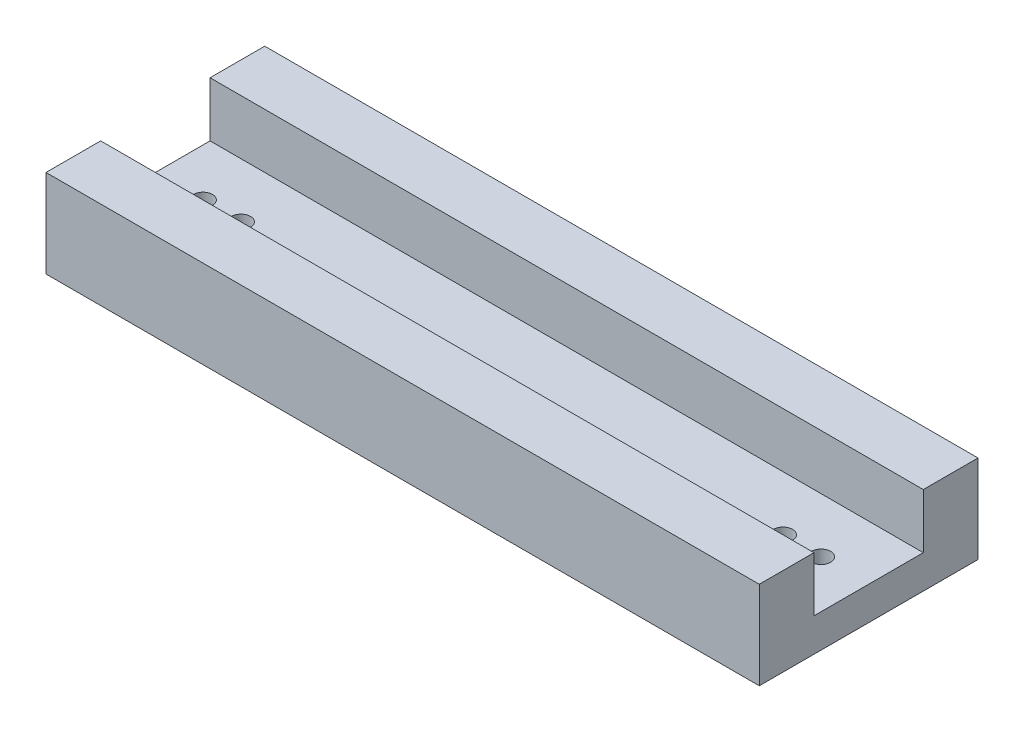
ISO-10303-21;
HEADER;
FILE_DESCRIPTION(('STEP AP214'),'2;1');
FILE_NAME('part.step','',(''),(''),'','','');
FILE_SCHEMA(('AUTOMOTIVE_DESIGN { 1 0 10303 214 1 1 1 1 }'));
ENDSEC;
DATA;
#1=APPLICATION_CONTEXT('core data for automotive mechanical design processes');
#2=APPLICATION_PROTOCOL_DEFINITION('international standard','automotive_design',2000,#1);
#3=PRODUCT_CONTEXT('',#1,'mechanical');
#4=PRODUCT('Part','Part','',(#3));
#5=PRODUCT_RELATED_PRODUCT_CATEGORY('part','',(#4));
#6=PRODUCT_DEFINITION_FORMATION('','',#4);
#7=PRODUCT_DEFINITION_CONTEXT('part definition',#1,'design');
#8=PRODUCT_DEFINITION('design','',#6,#7);
#9=PRODUCT_DEFINITION_SHAPE('','',#8);
#10=(LENGTH_UNIT() NAMED_UNIT(*) SI_UNIT(.MILLI.,.METRE.));
#11=(NAMED_UNIT(*) PLANE_ANGLE_UNIT() SI_UNIT($,.RADIAN.));
#12=(NAMED_UNIT(*) SI_UNIT($,.STERADIAN.) SOLID_ANGLE_UNIT());
#13=UNCERTAINTY_MEASURE_WITH_UNIT(LENGTH_MEASURE(1.E-05),#10,'distance_accuracy_value','');
#14=(GEOMETRIC_REPRESENTATION_CONTEXT(3) GLOBAL_UNCERTAINTY_ASSIGNED_CONTEXT((#13)) GLOBAL_UNIT_ASSIGNED_CONTEXT((#10,
#11,#12)) REPRESENTATION_CONTEXT('',''));
#15=CARTESIAN_POINT('',(0.,0.,0.));
#16=DIRECTION('',(0.,0.,1.));
#17=DIRECTION('',(1.,0.,0.));
#18=AXIS2_PLACEMENT_3D('',#15,#16,#17);
#19=CARTESIAN_POINT('',(150.,0.,0.));
#20=DIRECTION('',(0.,0.,-1.));
#21=DIRECTION('',(0.,1.,0.));
#22=AXIS2_PLACEMENT_3D('',#19,#20,#21);
#23=PLANE('',#22);
#24=DIRECTION('',(0.,-1.,0.));
#25=VECTOR('',#24,1.);
#26=CARTESIAN_POINT('',(0.,0.,0.));
#27=LINE('',#26,#25);
#28=CARTESIAN_POINT('',(0.,18.5,0.));
#29=VERTEX_POINT('',#28);
#30=CARTESIAN_POINT('',(0.,0.,0.));
#31=VERTEX_POINT('',#30);
#32=EDGE_CURVE('E133',#29,#31,#27,.T.);
#33=ORIENTED_EDGE('',*,*,#32,.T.);
#34=DIRECTION('',(-1.,0.,0.));
#35=VECTOR('',#34,1.);
#36=CARTESIAN_POINT('',(150.,0.,0.));
#37=LINE('',#36,#35);
#38=CARTESIAN_POINT('',(150.,0.,0.));
#39=VERTEX_POINT('',#38);
#40=EDGE_CURVE('E11',#39,#31,#37,.T.);
#41=ORIENTED_EDGE('',*,*,#40,.F.);
#42=DIRECTION('',(0.,-1.,0.));
#43=VECTOR('',#42,1.);
#44=CARTESIAN_POINT('',(150.,0.,0.));
#45=LINE('',#44,#43);
#46=CARTESIAN_POINT('',(150.,18.5,0.));
#47=VERTEX_POINT('',#46);
#48=EDGE_CURVE('E148',#47,#39,#45,.T.);
#49=ORIENTED_EDGE('',*,*,#48,.F.);
#50=DIRECTION('',(-1.,0.,0.));
#51=VECTOR('',#50,1.);
#52=CARTESIAN_POINT('',(150.,18.5,0.));
#53=LINE('',#52,#51);
#54=EDGE_CURVE('E129',#47,#29,#53,.T.);
#55=ORIENTED_EDGE('',*,*,#54,.T.);
#56=EDGE_LOOP('',(#33,#41,#49,#55));
#57=FACE_BOUND('',#56,.T.);
#58=ADVANCED_FACE('F35',(#57),#23,.F.);
#59=CARTESIAN_POINT('',(150.,0.,0.));
#60=DIRECTION('',(0.,1.,0.));
#61=DIRECTION('',(0.,0.,1.));
#62=AXIS2_PLACEMENT_3D('',#59,#60,#61);
#63=PLANE('',#62);
#64=CARTESIAN_POINT('',(18.,0.,-23.));
#65=DIRECTION('',(0.,-1.,0.));
#66=DIRECTION('',(0.,0.,1.));
#67=AXIS2_PLACEMENT_3D('',#64,#65,#66);
#68=CIRCLE('',#67,2.);
#69=CARTESIAN_POINT('',(18.,0.,-21.));
#70=VERTEX_POINT('',#69);
#71=EDGE_CURVE('E178',#70,#70,#68,.T.);
#72=ORIENTED_EDGE('',*,*,#71,.F.);
#73=EDGE_LOOP('',(#72));
#74=FACE_BOUND('',#73,.T.);
#75=CARTESIAN_POINT('',(132.,0.,-23.));
#76=DIRECTION('',(0.,-1.,0.));
#77=DIRECTION('',(0.,0.,-1.));
#78=AXIS2_PLACEMENT_3D('',#75,#76,#77);
#79=CIRCLE('',#78,2.);
#80=CARTESIAN_POINT('',(132.,0.,-25.));
#81=VERTEX_POINT('',#80);
#82=EDGE_CURVE('E168',#81,#81,#79,.T.);
#83=ORIENTED_EDGE('',*,*,#82,.F.);
#84=EDGE_LOOP('',(#83));
#85=FACE_BOUND('',#84,.T.);
#86=CARTESIAN_POINT('',(10.,0.,-23.));
#87=DIRECTION('',(0.,-1.,0.));
#88=DIRECTION('',(0.,0.,1.));
#89=AXIS2_PLACEMENT_3D('',#86,#87,#88);
#90=CIRCLE('',#89,2.);
#91=CARTESIAN_POINT('',(10.,0.,-21.));
#92=VERTEX_POINT('',#91);
#93=EDGE_CURVE('E165',#92,#92,#90,.T.);
#94=ORIENTED_EDGE('',*,*,#93,.F.);
#95=EDGE_LOOP('',(#94));
#96=FACE_BOUND('',#95,.T.);
#97=CARTESIAN_POINT('',(140.,0.,-23.));
#98=DIRECTION('',(0.,-1.,0.));
#99=DIRECTION('',(0.,0.,-1.));
#100=AXIS2_PLACEMENT_3D('',#97,#98,#99);
#101=CIRCLE('',#100,2.);
#102=CARTESIAN_POINT('',(140.,0.,-25.));
#103=VERTEX_POINT('',#102);
#104=EDGE_CURVE('E162',#103,#103,#101,.T.);
#105=ORIENTED_EDGE('',*,*,#104,.F.);
#106=EDGE_LOOP('',(#105));
#107=FACE_BOUND('',#106,.T.);
#108=DIRECTION('',(0.,0.,-1.));
#109=VECTOR('',#108,1.);
#110=CARTESIAN_POINT('',(0.,0.,0.));
#111=LINE('',#110,#109);
#112=CARTESIAN_POINT('',(0.,0.,-46.));
#113=VERTEX_POINT('',#112);
#114=EDGE_CURVE('E136',#31,#113,#111,.T.);
#115=ORIENTED_EDGE('',*,*,#114,.T.);
#116=DIRECTION('',(-1.,0.,0.));
#117=VECTOR('',#116,1.);
#118=CARTESIAN_POINT('',(150.,0.,-46.));
#119=LINE('',#118,#117);
#120=CARTESIAN_POINT('',(150.,0.,-46.));
#121=VERTEX_POINT('',#120);
#122=EDGE_CURVE('E44',#121,#113,#119,.T.);
#123=ORIENTED_EDGE('',*,*,#122,.F.);
#124=DIRECTION('',(0.,0.,-1.));
#125=VECTOR('',#124,1.);
#126=CARTESIAN_POINT('',(150.,0.,0.));
#127=LINE('',#126,#125);
#128=EDGE_CURVE('E96',#39,#121,#127,.T.);
#129=ORIENTED_EDGE('',*,*,#128,.F.);
#130=ORIENTED_EDGE('',*,*,#40,.T.);
#131=EDGE_LOOP('',(#115,#123,#129,#130));
#132=FACE_BOUND('',#131,.T.);
#133=ADVANCED_FACE('F216',(#74,#85,#96,#107,#132),#63,.F.);
#134=CARTESIAN_POINT('',(150.,0.,-46.));
#135=DIRECTION('',(0.,0.,1.));
#136=DIRECTION('',(1.,0.,0.));
#137=AXIS2_PLACEMENT_3D('',#134,#135,#136);
#138=PLANE('',#137);
#139=DIRECTION('',(0.,1.,0.));
#140=VECTOR('',#139,1.);
#141=CARTESIAN_POINT('',(0.,0.,-46.));
#142=LINE('',#141,#140);
#143=CARTESIAN_POINT('',(0.,18.5,-46.));
#144=VERTEX_POINT('',#143);
#145=EDGE_CURVE('E139',#113,#144,#142,.T.);
#146=ORIENTED_EDGE('',*,*,#145,.T.);
#147=DIRECTION('',(-1.,0.,0.));
#148=VECTOR('',#147,1.);
#149=CARTESIAN_POINT('',(150.,18.5,-46.));
#150=LINE('',#149,#148);
#151=CARTESIAN_POINT('',(150.,18.5,-46.));
#152=VERTEX_POINT('',#151);
#153=EDGE_CURVE('E155',#152,#144,#150,.T.);
#154=ORIENTED_EDGE('',*,*,#153,.F.);
#155=DIRECTION('',(0.,1.,0.));
#156=VECTOR('',#155,1.);
#157=CARTESIAN_POINT('',(150.,0.,-46.));
#158=LINE('',#157,#156);
#159=EDGE_CURVE('E185',#121,#152,#158,.T.);
#160=ORIENTED_EDGE('',*,*,#159,.F.);
#161=ORIENTED_EDGE('',*,*,#122,.T.);
#162=EDGE_LOOP('',(#146,#154,#160,#161));
#163=FACE_BOUND('',#162,.T.);
#164=ADVANCED_FACE('F220',(#163),#138,.F.);
#165=CARTESIAN_POINT('',(150.,18.5,-46.));
#166=DIRECTION('',(0.,-1.,0.));
#167=DIRECTION('',(0.,0.,-1.));
#168=AXIS2_PLACEMENT_3D('',#165,#166,#167);
#169=PLANE('',#168);
#170=DIRECTION('',(0.,0.,1.));
#171=VECTOR('',#170,1.);
#172=CARTESIAN_POINT('',(0.,18.5,-46.));
#173=LINE('',#172,#171);
#174=CARTESIAN_POINT('',(0.,18.5,-34.5));
#175=VERTEX_POINT('',#174);
#176=EDGE_CURVE('E141',#144,#175,#173,.T.);
#177=ORIENTED_EDGE('',*,*,#176,.T.);
#178=DIRECTION('',(-1.,0.,0.));
#179=VECTOR('',#178,1.);
#180=CARTESIAN_POINT('',(150.,18.5,-34.5));
#181=LINE('',#180,#179);
#182=CARTESIAN_POINT('',(150.,18.5,-34.5));
#183=VERTEX_POINT('',#182);
#184=EDGE_CURVE('E152',#183,#175,#181,.T.);
#185=ORIENTED_EDGE('',*,*,#184,.F.);
#186=DIRECTION('',(0.,0.,1.));
#187=VECTOR('',#186,1.);
#188=CARTESIAN_POINT('',(150.,18.5,-46.));
#189=LINE('',#188,#187);
#190=EDGE_CURVE('E187',#152,#183,#189,.T.);
#191=ORIENTED_EDGE('',*,*,#190,.F.);
#192=ORIENTED_EDGE('',*,*,#153,.T.);
#193=EDGE_LOOP('',(#177,#185,#191,#192));
#194=FACE_BOUND('',#193,.T.);
#195=ADVANCED_FACE('F193',(#194),#169,.F.);
#196=CARTESIAN_POINT('',(150.,18.5,-34.5));
#197=DIRECTION('',(0.,0.,-1.));
#198=DIRECTION('',(-1.,0.,0.));
#199=AXIS2_PLACEMENT_3D('',#196,#197,#198);
#200=PLANE('',#199);
#201=DIRECTION('',(0.,-1.,0.));
#202=VECTOR('',#201,1.);
#203=CARTESIAN_POINT('',(0.,18.5,-34.5));
#204=LINE('',#203,#202);
#205=CARTESIAN_POINT('',(0.,7.,-34.5));
#206=VERTEX_POINT('',#205);
#207=EDGE_CURVE('E143',#175,#206,#204,.T.);
#208=ORIENTED_EDGE('',*,*,#207,.T.);
#209=DIRECTION('',(-1.,0.,0.));
#210=VECTOR('',#209,1.);
#211=CARTESIAN_POINT('',(150.,7.,-34.5));
#212=LINE('',#211,#210);
#213=CARTESIAN_POINT('',(150.,7.,-34.5));
#214=VERTEX_POINT('',#213);
#215=EDGE_CURVE('E124',#214,#206,#212,.T.);
#216=ORIENTED_EDGE('',*,*,#215,.F.);
#217=DIRECTION('',(0.,-1.,0.));
#218=VECTOR('',#217,1.);
#219=CARTESIAN_POINT('',(150.,18.5,-34.5));
#220=LINE('',#219,#218);
#221=EDGE_CURVE('E115',#183,#214,#220,.T.);
#222=ORIENTED_EDGE('',*,*,#221,.F.);
#223=ORIENTED_EDGE('',*,*,#184,.T.);
#224=EDGE_LOOP('',(#208,#216,#222,#223));
#225=FACE_BOUND('',#224,.T.);
#226=ADVANCED_FACE('F197',(#225),#200,.F.);
#227=CARTESIAN_POINT('',(150.,7.,-11.5));
#228=DIRECTION('',(0.,-1.,0.));
#229=DIRECTION('',(0.,0.,-1.));
#230=AXIS2_PLACEMENT_3D('',#227,#228,#229);
#231=PLANE('',#230);
#232=CARTESIAN_POINT('',(18.,7.,-23.));
#233=DIRECTION('',(0.,-1.,0.));
#234=DIRECTION('',(0.,0.,-1.));
#235=AXIS2_PLACEMENT_3D('',#232,#233,#234);
#236=CIRCLE('',#235,2.);
#237=CARTESIAN_POINT('',(18.,7.,-25.));
#238=VERTEX_POINT('',#237);
#239=EDGE_CURVE('E38',#238,#238,#236,.T.);
#240=ORIENTED_EDGE('',*,*,#239,.T.);
#241=EDGE_LOOP('',(#240));
#242=FACE_BOUND('',#241,.T.);
#243=CARTESIAN_POINT('',(132.,7.,-23.));
#244=DIRECTION('',(0.,-1.,0.));
#245=DIRECTION('',(0.,0.,-1.));
#246=AXIS2_PLACEMENT_3D('',#243,#244,#245);
#247=CIRCLE('',#246,2.);
#248=CARTESIAN_POINT('',(132.,7.,-25.));
#249=VERTEX_POINT('',#248);
#250=EDGE_CURVE('E166',#249,#249,#247,.T.);
#251=ORIENTED_EDGE('',*,*,#250,.T.);
#252=EDGE_LOOP('',(#251));
#253=FACE_BOUND('',#252,.T.);
#254=CARTESIAN_POINT('',(10.,7.,-23.));
#255=DIRECTION('',(0.,-1.,0.));
#256=DIRECTION('',(0.,0.,-1.));
#257=AXIS2_PLACEMENT_3D('',#254,#255,#256);
#258=CIRCLE('',#257,2.);
#259=CARTESIAN_POINT('',(10.,7.,-25.));
#260=VERTEX_POINT('',#259);
#261=EDGE_CURVE('E163',#260,#260,#258,.T.);
#262=ORIENTED_EDGE('',*,*,#261,.T.);
#263=EDGE_LOOP('',(#262));
#264=FACE_BOUND('',#263,.T.);
#265=CARTESIAN_POINT('',(140.,7.,-23.));
#266=DIRECTION('',(0.,-1.,0.));
#267=DIRECTION('',(0.,0.,-1.));
#268=AXIS2_PLACEMENT_3D('',#265,#266,#267);
#269=CIRCLE('',#268,2.);
#270=CARTESIAN_POINT('',(140.,7.,-25.));
#271=VERTEX_POINT('',#270);
#272=EDGE_CURVE('E137',#271,#271,#269,.T.);
#273=ORIENTED_EDGE('',*,*,#272,.T.);
#274=EDGE_LOOP('',(#273));
#275=FACE_BOUND('',#274,.T.);
#276=DIRECTION('',(0.,0.,1.));
#277=VECTOR('',#276,1.);
#278=CARTESIAN_POINT('',(0.,7.,-11.5));
#279=LINE('',#278,#277);
#280=CARTESIAN_POINT('',(0.,7.,-11.5));
#281=VERTEX_POINT('',#280);
#282=EDGE_CURVE('E123',#206,#281,#279,.T.);
#283=ORIENTED_EDGE('',*,*,#282,.T.);
#284=DIRECTION('',(-1.,0.,0.));
#285=VECTOR('',#284,1.);
#286=CARTESIAN_POINT('',(150.,7.,-11.5));
#287=LINE('',#286,#285);
#288=CARTESIAN_POINT('',(150.,7.,-11.5));
#289=VERTEX_POINT('',#288);
#290=EDGE_CURVE('E120',#289,#281,#287,.T.);
#291=ORIENTED_EDGE('',*,*,#290,.F.);
#292=DIRECTION('',(0.,0.,1.));
#293=VECTOR('',#292,1.);
#294=CARTESIAN_POINT('',(150.,7.,-11.5));
#295=LINE('',#294,#293);
#296=EDGE_CURVE('E109',#214,#289,#295,.T.);
#297=ORIENTED_EDGE('',*,*,#296,.F.);
#298=ORIENTED_EDGE('',*,*,#215,.T.);
#299=EDGE_LOOP('',(#283,#291,#297,#298));
#300=FACE_BOUND('',#299,.T.);
#301=ADVANCED_FACE('F121',(#242,#253,#264,#275,#300),#231,.F.);
#302=CARTESIAN_POINT('',(150.,18.5,-11.5));
#303=DIRECTION('',(0.,0.,1.));
#304=DIRECTION('',(1.,0.,0.));
#305=AXIS2_PLACEMENT_3D('',#302,#303,#304);
#306=PLANE('',#305);
#307=DIRECTION('',(0.,1.,0.));
#308=VECTOR('',#307,1.);
#309=CARTESIAN_POINT('',(0.,18.5,-11.5));
#310=LINE('',#309,#308);
#311=CARTESIAN_POINT('',(0.,18.5,-11.5));
#312=VERTEX_POINT('',#311);
#313=EDGE_CURVE('E82',#281,#312,#310,.T.);
#314=ORIENTED_EDGE('',*,*,#313,.T.);
#315=DIRECTION('',(-1.,0.,0.));
#316=VECTOR('',#315,1.);
#317=CARTESIAN_POINT('',(150.,18.5,-11.5));
#318=LINE('',#317,#316);
#319=CARTESIAN_POINT('',(150.,18.5,-11.5));
#320=VERTEX_POINT('',#319);
#321=EDGE_CURVE('E125',#320,#312,#318,.T.);
#322=ORIENTED_EDGE('',*,*,#321,.F.);
#323=DIRECTION('',(0.,1.,0.));
#324=VECTOR('',#323,1.);
#325=CARTESIAN_POINT('',(150.,18.5,-11.5));
#326=LINE('',#325,#324);
#327=EDGE_CURVE('E113',#289,#320,#326,.T.);
#328=ORIENTED_EDGE('',*,*,#327,.F.);
#329=ORIENTED_EDGE('',*,*,#290,.T.);
#330=EDGE_LOOP('',(#314,#322,#328,#329));
#331=FACE_BOUND('',#330,.T.);
#332=ADVANCED_FACE('F127',(#331),#306,.F.);
#333=CARTESIAN_POINT('',(150.,18.5,0.));
#334=DIRECTION('',(0.,-1.,0.));
#335=DIRECTION('',(0.,0.,-1.));
#336=AXIS2_PLACEMENT_3D('',#333,#334,#335);
#337=PLANE('',#336);
#338=DIRECTION('',(0.,0.,1.));
#339=VECTOR('',#338,1.);
#340=CARTESIAN_POINT('',(0.,18.5,0.));
#341=LINE('',#340,#339);
#342=EDGE_CURVE('E88',#312,#29,#341,.T.);
#343=ORIENTED_EDGE('',*,*,#342,.T.);
#344=ORIENTED_EDGE('',*,*,#54,.F.);
#345=DIRECTION('',(0.,0.,1.));
#346=VECTOR('',#345,1.);
#347=CARTESIAN_POINT('',(150.,18.5,0.));
#348=LINE('',#347,#346);
#349=EDGE_CURVE('E53',#320,#47,#348,.T.);
#350=ORIENTED_EDGE('',*,*,#349,.F.);
#351=ORIENTED_EDGE('',*,*,#321,.T.);
#352=EDGE_LOOP('',(#343,#344,#350,#351));
#353=FACE_BOUND('',#352,.T.);
#354=ADVANCED_FACE('F205',(#353),#337,.F.);
#355=CARTESIAN_POINT('',(150.,0.,0.));
#356=DIRECTION('',(-1.,0.,0.));
#357=DIRECTION('',(0.,0.,1.));
#358=AXIS2_PLACEMENT_3D('',#355,#356,#357);
#359=PLANE('',#358);
#360=ORIENTED_EDGE('',*,*,#48,.T.);
#361=ORIENTED_EDGE('',*,*,#128,.T.);
#362=ORIENTED_EDGE('',*,*,#159,.T.);
#363=ORIENTED_EDGE('',*,*,#190,.T.);
#364=ORIENTED_EDGE('',*,*,#221,.T.);
#365=ORIENTED_EDGE('',*,*,#296,.T.);
#366=ORIENTED_EDGE('',*,*,#327,.T.);
#367=ORIENTED_EDGE('',*,*,#349,.T.);
#368=EDGE_LOOP('',(#360,#361,#362,#363,#364,#365,#366,#367));
#369=FACE_BOUND('',#368,.T.);
#370=ADVANCED_FACE('F111',(#369),#359,.F.);
#371=CARTESIAN_POINT('',(0.,0.,0.));
#372=DIRECTION('',(-1.,0.,0.));
#373=DIRECTION('',(0.,0.,1.));
#374=AXIS2_PLACEMENT_3D('',#371,#372,#373);
#375=PLANE('',#374);
#376=ORIENTED_EDGE('',*,*,#32,.F.);
#377=ORIENTED_EDGE('',*,*,#342,.F.);
#378=ORIENTED_EDGE('',*,*,#313,.F.);
#379=ORIENTED_EDGE('',*,*,#282,.F.);
#380=ORIENTED_EDGE('',*,*,#207,.F.);
#381=ORIENTED_EDGE('',*,*,#176,.F.);
#382=ORIENTED_EDGE('',*,*,#145,.F.);
#383=ORIENTED_EDGE('',*,*,#114,.F.);
#384=EDGE_LOOP('',(#376,#377,#378,#379,#380,#381,#382,#383));
#385=FACE_BOUND('',#384,.T.);
#386=ADVANCED_FACE('F200',(#385),#375,.T.);
#387=CARTESIAN_POINT('',(140.,18.5,-23.));
#388=DIRECTION('',(0.,-1.,0.));
#389=DIRECTION('',(0.,0.,-1.));
#390=AXIS2_PLACEMENT_3D('',#387,#388,#389);
#391=CYLINDRICAL_SURFACE('',#390,2.);
#392=ORIENTED_EDGE('',*,*,#104,.T.);
#393=EDGE_LOOP('',(#392));
#394=FACE_BOUND('',#393,.T.);
#395=ORIENTED_EDGE('',*,*,#272,.F.);
#396=EDGE_LOOP('',(#395));
#397=FACE_BOUND('',#396,.T.);
#398=ADVANCED_FACE('F244',(#394,#397),#391,.F.);
#399=CARTESIAN_POINT('',(10.,18.5,-23.));
#400=DIRECTION('',(0.,-1.,0.));
#401=DIRECTION('',(0.,0.,-1.));
#402=AXIS2_PLACEMENT_3D('',#399,#400,#401);
#403=CYLINDRICAL_SURFACE('',#402,2.);
#404=ORIENTED_EDGE('',*,*,#93,.T.);
#405=EDGE_LOOP('',(#404));
#406=FACE_BOUND('',#405,.T.);
#407=ORIENTED_EDGE('',*,*,#261,.F.);
#408=EDGE_LOOP('',(#407));
#409=FACE_BOUND('',#408,.T.);
#410=ADVANCED_FACE('F246',(#406,#409),#403,.F.);
#411=CARTESIAN_POINT('',(132.,18.5,-23.));
#412=DIRECTION('',(0.,-1.,0.));
#413=DIRECTION('',(0.,0.,-1.));
#414=AXIS2_PLACEMENT_3D('',#411,#412,#413);
#415=CYLINDRICAL_SURFACE('',#414,2.);
#416=ORIENTED_EDGE('',*,*,#82,.T.);
#417=EDGE_LOOP('',(#416));
#418=FACE_BOUND('',#417,.T.);
#419=ORIENTED_EDGE('',*,*,#250,.F.);
#420=EDGE_LOOP('',(#419));
#421=FACE_BOUND('',#420,.T.);
#422=ADVANCED_FACE('F253',(#418,#421),#415,.F.);
#423=CARTESIAN_POINT('',(18.,18.5,-23.));
#424=DIRECTION('',(0.,-1.,0.));
#425=DIRECTION('',(0.,0.,-1.));
#426=AXIS2_PLACEMENT_3D('',#423,#424,#425);
#427=CYLINDRICAL_SURFACE('',#426,2.);
#428=ORIENTED_EDGE('',*,*,#71,.T.);
#429=EDGE_LOOP('',(#428));
#430=FACE_BOUND('',#429,.T.);
#431=ORIENTED_EDGE('',*,*,#239,.F.);
#432=EDGE_LOOP('',(#431));
#433=FACE_BOUND('',#432,.T.);
#434=ADVANCED_FACE('F259',(#430,#433),#427,.F.);
#435=CLOSED_SHELL('',(#58,#133,#164,#195,#226,#301,#332,#354,#370,#386,#398,#410,#422,#434));
#436=MANIFOLD_SOLID_BREP('B2',#435);
#437=ADVANCED_BREP_SHAPE_REPRESENTATION('',(#18,#436),#14);
#438=SHAPE_DEFINITION_REPRESENTATION(#9,#437);
ENDSEC;
END-ISO-10303-21;
